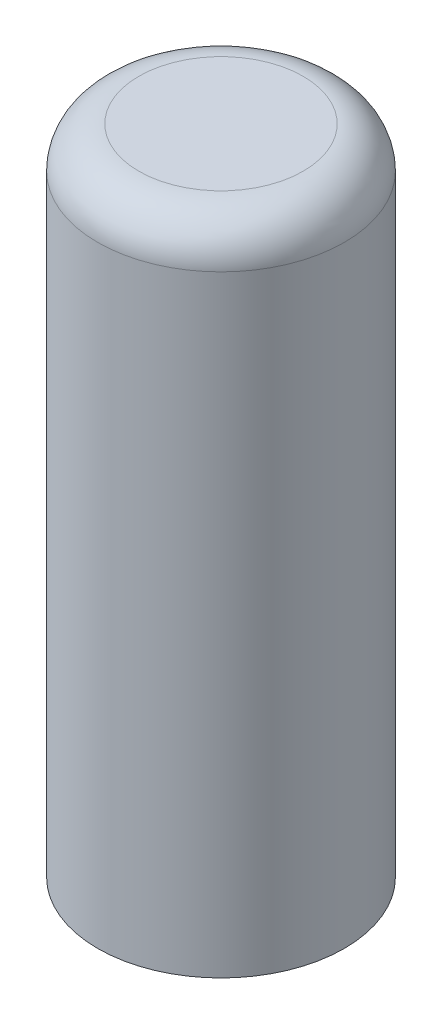
ISO-10303-21;
HEADER;
FILE_DESCRIPTION(('STEP AP214'),'2;1');
FILE_NAME('part.step','',(''),(''),'','','');
FILE_SCHEMA(('AUTOMOTIVE_DESIGN { 1 0 10303 214 1 1 1 1 }'));
ENDSEC;
DATA;
#1=APPLICATION_CONTEXT('core data for automotive mechanical design processes');
#2=APPLICATION_PROTOCOL_DEFINITION('international standard','automotive_design',2000,#1);
#3=PRODUCT_CONTEXT('',#1,'mechanical');
#4=PRODUCT('Part','Part','',(#3));
#5=PRODUCT_RELATED_PRODUCT_CATEGORY('part','',(#4));
#6=PRODUCT_DEFINITION_FORMATION('','',#4);
#7=PRODUCT_DEFINITION_CONTEXT('part definition',#1,'design');
#8=PRODUCT_DEFINITION('design','',#6,#7);
#9=PRODUCT_DEFINITION_SHAPE('','',#8);
#10=(LENGTH_UNIT() NAMED_UNIT(*) SI_UNIT(.MILLI.,.METRE.));
#11=(NAMED_UNIT(*) PLANE_ANGLE_UNIT() SI_UNIT($,.RADIAN.));
#12=(NAMED_UNIT(*) SI_UNIT($,.STERADIAN.) SOLID_ANGLE_UNIT());
#13=UNCERTAINTY_MEASURE_WITH_UNIT(LENGTH_MEASURE(1.E-05),#10,'distance_accuracy_value','');
#14=(GEOMETRIC_REPRESENTATION_CONTEXT(3) GLOBAL_UNCERTAINTY_ASSIGNED_CONTEXT((#13)) GLOBAL_UNIT_ASSIGNED_CONTEXT((#10,
#11,#12)) REPRESENTATION_CONTEXT('',''));
#15=CARTESIAN_POINT('',(0.,0.,0.));
#16=DIRECTION('',(0.,0.,1.));
#17=DIRECTION('',(1.,0.,0.));
#18=AXIS2_PLACEMENT_3D('',#15,#16,#17);
#19=CARTESIAN_POINT('',(0.,7.9375,0.));
#20=DIRECTION('',(0.,-1.,0.));
#21=DIRECTION('',(0.,0.,-1.));
#22=AXIS2_PLACEMENT_3D('',#19,#20,#21);
#23=CYLINDRICAL_SURFACE('',#22,1.5);
#24=CARTESIAN_POINT('',(0.,7.4375,0.));
#25=DIRECTION('',(0.,1.,0.));
#26=DIRECTION('',(0.,0.,1.));
#27=AXIS2_PLACEMENT_3D('',#24,#25,#26);
#28=CIRCLE('',#27,1.5);
#29=CARTESIAN_POINT('',(0.,7.4375,1.5));
#30=VERTEX_POINT('',#29);
#31=EDGE_CURVE('E10',#30,#30,#28,.F.);
#32=ORIENTED_EDGE('',*,*,#31,.T.);
#33=EDGE_LOOP('',(#32));
#34=FACE_BOUND('',#33,.T.);
#35=CARTESIAN_POINT('',(0.,0.,0.));
#36=DIRECTION('',(0.,1.,0.));
#37=DIRECTION('',(0.,0.,1.));
#38=AXIS2_PLACEMENT_3D('',#35,#36,#37);
#39=CIRCLE('',#38,1.5);
#40=CARTESIAN_POINT('',(0.,0.,1.5));
#41=VERTEX_POINT('',#40);
#42=EDGE_CURVE('E49',#41,#41,#39,.T.);
#43=ORIENTED_EDGE('',*,*,#42,.T.);
#44=EDGE_LOOP('',(#43));
#45=FACE_BOUND('',#44,.T.);
#46=ADVANCED_FACE('F36',(#34,#45),#23,.T.);
#47=CARTESIAN_POINT('',(0.,7.9375,0.));
#48=DIRECTION('',(0.,1.,0.));
#49=DIRECTION('',(0.,0.,1.));
#50=AXIS2_PLACEMENT_3D('',#47,#48,#49);
#51=PLANE('',#50);
#52=CARTESIAN_POINT('',(0.,7.9375,0.));
#53=DIRECTION('',(0.,1.,0.));
#54=DIRECTION('',(0.,0.,1.));
#55=AXIS2_PLACEMENT_3D('',#52,#53,#54);
#56=CIRCLE('',#55,1.);
#57=CARTESIAN_POINT('',(0.,7.9375,1.));
#58=VERTEX_POINT('',#57);
#59=EDGE_CURVE('E44',#58,#58,#56,.T.);
#60=ORIENTED_EDGE('',*,*,#59,.T.);
#61=EDGE_LOOP('',(#60));
#62=FACE_BOUND('',#61,.T.);
#63=ADVANCED_FACE('F60',(#62),#51,.T.);
#64=CARTESIAN_POINT('',(0.,0.,0.));
#65=DIRECTION('',(0.,1.,0.));
#66=DIRECTION('',(0.,0.,1.));
#67=AXIS2_PLACEMENT_3D('',#64,#65,#66);
#68=PLANE('',#67);
#69=ORIENTED_EDGE('',*,*,#42,.F.);
#70=EDGE_LOOP('',(#69));
#71=FACE_BOUND('',#70,.T.);
#72=ADVANCED_FACE('F58',(#71),#68,.F.);
#73=CARTESIAN_POINT('',(0.,7.4375,0.));
#74=DIRECTION('',(0.,1.,0.));
#75=DIRECTION('',(0.,0.,1.));
#76=AXIS2_PLACEMENT_3D('',#73,#74,#75);
#77=TOROIDAL_SURFACE('',#76,1.,0.5);
#78=ORIENTED_EDGE('',*,*,#31,.F.);
#79=EDGE_LOOP('',(#78));
#80=FACE_BOUND('',#79,.T.);
#81=ORIENTED_EDGE('',*,*,#59,.F.);
#82=EDGE_LOOP('',(#81));
#83=FACE_BOUND('',#82,.T.);
#84=ADVANCED_FACE('F38',(#80,#83),#77,.T.);
#85=CLOSED_SHELL('',(#46,#63,#72,#84));
#86=MANIFOLD_SOLID_BREP('B2',#85);
#87=ADVANCED_BREP_SHAPE_REPRESENTATION('',(#18,#86),#14);
#88=SHAPE_DEFINITION_REPRESENTATION(#9,#87);
ENDSEC;
END-ISO-10303-21;
